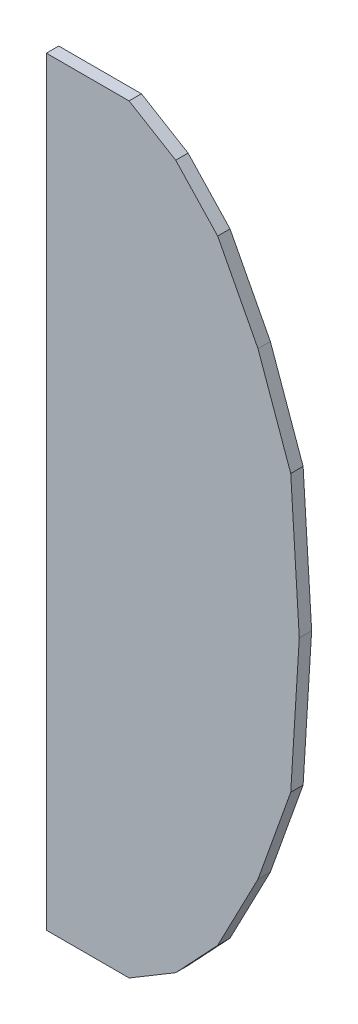
ISO-10303-21;
HEADER;
FILE_DESCRIPTION(('STEP AP214'),'2;1');
FILE_NAME('part.step','',(''),(''),'','','');
FILE_SCHEMA(('AUTOMOTIVE_DESIGN { 1 0 10303 214 1 1 1 1 }'));
ENDSEC;
DATA;
#1=APPLICATION_CONTEXT('core data for automotive mechanical design processes');
#2=APPLICATION_PROTOCOL_DEFINITION('international standard','automotive_design',2000,#1);
#3=PRODUCT_CONTEXT('',#1,'mechanical');
#4=PRODUCT('Part','Part','',(#3));
#5=PRODUCT_RELATED_PRODUCT_CATEGORY('part','',(#4));
#6=PRODUCT_DEFINITION_FORMATION('','',#4);
#7=PRODUCT_DEFINITION_CONTEXT('part definition',#1,'design');
#8=PRODUCT_DEFINITION('design','',#6,#7);
#9=PRODUCT_DEFINITION_SHAPE('','',#8);
#10=(LENGTH_UNIT() NAMED_UNIT(*) SI_UNIT(.MILLI.,.METRE.));
#11=(NAMED_UNIT(*) PLANE_ANGLE_UNIT() SI_UNIT($,.RADIAN.));
#12=(NAMED_UNIT(*) SI_UNIT($,.STERADIAN.) SOLID_ANGLE_UNIT());
#13=UNCERTAINTY_MEASURE_WITH_UNIT(LENGTH_MEASURE(1.E-05),#10,'distance_accuracy_value','');
#14=(GEOMETRIC_REPRESENTATION_CONTEXT(3) GLOBAL_UNCERTAINTY_ASSIGNED_CONTEXT((#13)) GLOBAL_UNIT_ASSIGNED_CONTEXT((#10,
#11,#12)) REPRESENTATION_CONTEXT('',''));
#15=CARTESIAN_POINT('',(0.,0.,0.));
#16=DIRECTION('',(0.,0.,1.));
#17=DIRECTION('',(1.,0.,0.));
#18=AXIS2_PLACEMENT_3D('',#15,#16,#17);
#19=CARTESIAN_POINT('',(31.874504293372,48.37997445989,1.1595000001));
#20=DIRECTION('',(0.,0.,1.));
#21=DIRECTION('',(1.,0.,0.));
#22=AXIS2_PLACEMENT_3D('',#19,#20,#21);
#23=PLANE('',#22);
#24=DIRECTION('',(-0.684511224486077,0.729002320677082,0.));
#25=VECTOR('',#24,1.);
#26=CARTESIAN_POINT('',(31.902834472656,48.741196289062,1.1595000001));
#27=LINE('',#26,#25);
#28=CARTESIAN_POINT('',(31.94591796875,48.6953125,1.1595000001));
#29=VERTEX_POINT('',#28);
#30=CARTESIAN_POINT('',(31.902834472656,48.741196289062,1.1595000001));
#31=VERTEX_POINT('',#30);
#32=EDGE_CURVE('E141',#29,#31,#27,.T.);
#33=ORIENTED_EDGE('',*,*,#32,.T.);
#34=DIRECTION('',(-0.857026283175948,0.515272694740969,0.));
#35=VECTOR('',#34,1.);
#36=CARTESIAN_POINT('',(31.854926757813,48.77,1.1595000001));
#37=LINE('',#36,#35);
#38=CARTESIAN_POINT('',(31.854926757813,48.77,1.1595000001));
#39=VERTEX_POINT('',#38);
#40=EDGE_CURVE('E210',#31,#39,#37,.T.);
#41=ORIENTED_EDGE('',*,*,#40,.T.);
#42=DIRECTION('',(-1.,0.,0.));
#43=VECTOR('',#42,1.);
#44=CARTESIAN_POINT('',(31.77,48.77,1.1595000001));
#45=LINE('',#44,#43);
#46=CARTESIAN_POINT('',(31.77,48.77,1.1595000001));
#47=VERTEX_POINT('',#46);
#48=EDGE_CURVE('E147',#39,#47,#45,.T.);
#49=ORIENTED_EDGE('',*,*,#48,.T.);
#50=DIRECTION('',(0.,-1.,0.));
#51=VECTOR('',#50,1.);
#52=CARTESIAN_POINT('',(31.77,47.99,1.1595000001));
#53=LINE('',#52,#51);
#54=CARTESIAN_POINT('',(31.77,47.99,1.1595000001));
#55=VERTEX_POINT('',#54);
#56=EDGE_CURVE('E11',#47,#55,#53,.T.);
#57=ORIENTED_EDGE('',*,*,#56,.T.);
#58=DIRECTION('',(1.,0.,0.));
#59=VECTOR('',#58,1.);
#60=CARTESIAN_POINT('',(31.855014648438,47.99,1.1595000001));
#61=LINE('',#60,#59);
#62=CARTESIAN_POINT('',(31.855014648438,47.99,1.1595000001));
#63=VERTEX_POINT('',#62);
#64=EDGE_CURVE('E28',#55,#63,#61,.T.);
#65=ORIENTED_EDGE('',*,*,#64,.T.);
#66=DIRECTION('',(0.857955823316851,0.513723471564911,0.));
#67=VECTOR('',#66,1.);
#68=CARTESIAN_POINT('',(31.902890625,48.018666992187,1.1595000001));
#69=LINE('',#68,#67);
#70=CARTESIAN_POINT('',(31.902890625,48.018666992187,1.1595000001));
#71=VERTEX_POINT('',#70);
#72=EDGE_CURVE('E93',#63,#71,#69,.T.);
#73=ORIENTED_EDGE('',*,*,#72,.T.);
#74=DIRECTION('',(0.684553491121047,0.72896263127405,0.));
#75=VECTOR('',#74,1.);
#76=CARTESIAN_POINT('',(31.945905761719,48.06447265625,1.1595000001));
#77=LINE('',#76,#75);
#78=CARTESIAN_POINT('',(31.945905761719,48.06447265625,1.1595000001));
#79=VERTEX_POINT('',#78);
#80=EDGE_CURVE('E88',#71,#79,#77,.T.);
#81=ORIENTED_EDGE('',*,*,#80,.T.);
#82=DIRECTION('',(0.461944236420167,0.88690897077332,0.));
#83=VECTOR('',#82,1.);
#84=CARTESIAN_POINT('',(31.987321777344,48.143989257813,1.1595000001));
#85=LINE('',#84,#83);
#86=CARTESIAN_POINT('',(31.987321777344,48.143989257813,1.1595000001));
#87=VERTEX_POINT('',#86);
#88=EDGE_CURVE('E118',#79,#87,#85,.T.);
#89=ORIENTED_EDGE('',*,*,#88,.T.);
#90=DIRECTION('',(0.336354954825115,0.941735283593322,0.));
#91=VECTOR('',#90,1.);
#92=CARTESIAN_POINT('',(32.020959472656,48.238168945312,1.1595000001));
#93=LINE('',#92,#91);
#94=CARTESIAN_POINT('',(32.020959472656,48.238168945312,1.1595000001));
#95=VERTEX_POINT('',#94);
#96=EDGE_CURVE('E158',#87,#95,#93,.T.);
#97=ORIENTED_EDGE('',*,*,#96,.T.);
#98=DIRECTION('',(0.0617403234525635,0.998092246468217,0.));
#99=VECTOR('',#98,1.);
#100=CARTESIAN_POINT('',(32.0297265625,48.379897460937,1.1595000001));
#101=LINE('',#100,#99);
#102=CARTESIAN_POINT('',(32.0297265625,48.379897460937,1.1595000001));
#103=VERTEX_POINT('',#102);
#104=EDGE_CURVE('E153',#95,#103,#101,.T.);
#105=ORIENTED_EDGE('',*,*,#104,.T.);
#106=DIRECTION('',(-0.0617682186821101,0.998090520524486,0.));
#107=VECTOR('',#106,1.);
#108=CARTESIAN_POINT('',(32.020954589844,48.521640625,1.1595000001));
#109=LINE('',#108,#107);
#110=CARTESIAN_POINT('',(32.020954589844,48.521640625,1.1595000001));
#111=VERTEX_POINT('',#110);
#112=EDGE_CURVE('E200',#103,#111,#109,.T.);
#113=ORIENTED_EDGE('',*,*,#112,.T.);
#114=DIRECTION('',(-0.33606439618799,0.941839010454972,0.));
#115=VECTOR('',#114,1.);
#116=CARTESIAN_POINT('',(31.987321777344,48.6158984375,1.1595000001));
#117=LINE('',#116,#115);
#118=CARTESIAN_POINT('',(31.987321777344,48.6158984375,1.1595000001));
#119=VERTEX_POINT('',#118);
#120=EDGE_CURVE('E162',#111,#119,#117,.T.);
#121=ORIENTED_EDGE('',*,*,#120,.T.);
#122=DIRECTION('',(-0.46230606285075,0.88672042056752,0.));
#123=VECTOR('',#122,1.);
#124=CARTESIAN_POINT('',(31.94591796875,48.6953125,1.1595000001));
#125=LINE('',#124,#123);
#126=EDGE_CURVE('E132',#119,#29,#125,.T.);
#127=ORIENTED_EDGE('',*,*,#126,.T.);
#128=EDGE_LOOP('',(#33,#41,#49,#57,#65,#73,#81,#89,#97,#105,#113,#121,#127));
#129=FACE_BOUND('',#128,.T.);
#130=ADVANCED_FACE('F17',(#129),#23,.T.);
#131=CARTESIAN_POINT('',(31.77,47.99,1.1468000001));
#132=DIRECTION('',(1.,0.,0.));
#133=DIRECTION('',(0.,1.,0.));
#134=AXIS2_PLACEMENT_3D('',#131,#132,#133);
#135=PLANE('',#134);
#136=DIRECTION('',(0.,0.,-1.));
#137=VECTOR('',#136,1.);
#138=CARTESIAN_POINT('',(31.77,48.77,1.1468000001));
#139=LINE('',#138,#137);
#140=CARTESIAN_POINT('',(31.77,48.77,1.1468000001));
#141=VERTEX_POINT('',#140);
#142=EDGE_CURVE('E130',#47,#141,#139,.T.);
#143=ORIENTED_EDGE('',*,*,#142,.T.);
#144=DIRECTION('',(0.,-1.,0.));
#145=VECTOR('',#144,1.);
#146=CARTESIAN_POINT('',(31.77,48.37997445989,1.1468000001));
#147=LINE('',#146,#145);
#148=CARTESIAN_POINT('',(31.77,47.99,1.1468000001));
#149=VERTEX_POINT('',#148);
#150=EDGE_CURVE('E178',#141,#149,#147,.T.);
#151=ORIENTED_EDGE('',*,*,#150,.T.);
#152=DIRECTION('',(0.,0.,1.));
#153=VECTOR('',#152,1.);
#154=CARTESIAN_POINT('',(31.77,47.99,1.1468000001));
#155=LINE('',#154,#153);
#156=EDGE_CURVE('E100',#149,#55,#155,.T.);
#157=ORIENTED_EDGE('',*,*,#156,.T.);
#158=ORIENTED_EDGE('',*,*,#56,.F.);
#159=EDGE_LOOP('',(#143,#151,#157,#158));
#160=FACE_BOUND('',#159,.T.);
#161=ADVANCED_FACE('F294',(#160),#135,.F.);
#162=CARTESIAN_POINT('',(31.855014648438,47.99,1.1468000001));
#163=DIRECTION('',(0.,1.,0.));
#164=DIRECTION('',(1.,0.,0.));
#165=AXIS2_PLACEMENT_3D('',#162,#163,#164);
#166=PLANE('',#165);
#167=ORIENTED_EDGE('',*,*,#156,.F.);
#168=DIRECTION('',(1.,0.,0.));
#169=VECTOR('',#168,1.);
#170=CARTESIAN_POINT('',(31.874504293372,47.99,1.1468000001));
#171=LINE('',#170,#169);
#172=CARTESIAN_POINT('',(31.855014648438,47.99,1.1468000001));
#173=VERTEX_POINT('',#172);
#174=EDGE_CURVE('E187',#149,#173,#171,.T.);
#175=ORIENTED_EDGE('',*,*,#174,.T.);
#176=DIRECTION('',(0.,0.,1.));
#177=VECTOR('',#176,1.);
#178=CARTESIAN_POINT('',(31.855014648438,47.99,1.1468000001));
#179=LINE('',#178,#177);
#180=EDGE_CURVE('E101',#173,#63,#179,.T.);
#181=ORIENTED_EDGE('',*,*,#180,.T.);
#182=ORIENTED_EDGE('',*,*,#64,.F.);
#183=EDGE_LOOP('',(#167,#175,#181,#182));
#184=FACE_BOUND('',#183,.T.);
#185=ADVANCED_FACE('F308',(#184),#166,.F.);
#186=CARTESIAN_POINT('',(31.902890625,48.018666992187,1.1468000001));
#187=DIRECTION('',(-0.513723471564911,0.857955823316851,0.));
#188=DIRECTION('',(0.,0.,1.));
#189=AXIS2_PLACEMENT_3D('',#186,#187,#188);
#190=PLANE('',#189);
#191=ORIENTED_EDGE('',*,*,#180,.F.);
#192=DIRECTION('',(0.857955823316851,0.513723471564911,0.));
#193=VECTOR('',#192,1.);
#194=CARTESIAN_POINT('',(31.855014648438,47.99,1.1468000001));
#195=LINE('',#194,#193);
#196=CARTESIAN_POINT('',(31.902890625,48.018666992187,1.1468000001));
#197=VERTEX_POINT('',#196);
#198=EDGE_CURVE('E115',#173,#197,#195,.T.);
#199=ORIENTED_EDGE('',*,*,#198,.T.);
#200=DIRECTION('',(0.,0.,1.));
#201=VECTOR('',#200,1.);
#202=CARTESIAN_POINT('',(31.902890625,48.018666992187,1.1468000001));
#203=LINE('',#202,#201);
#204=EDGE_CURVE('E107',#197,#71,#203,.T.);
#205=ORIENTED_EDGE('',*,*,#204,.T.);
#206=ORIENTED_EDGE('',*,*,#72,.F.);
#207=EDGE_LOOP('',(#191,#199,#205,#206));
#208=FACE_BOUND('',#207,.T.);
#209=ADVANCED_FACE('F113',(#208),#190,.F.);
#210=CARTESIAN_POINT('',(31.945905761719,48.06447265625,1.1468000001));
#211=DIRECTION('',(-0.72896263127405,0.684553491121047,0.));
#212=DIRECTION('',(0.,0.,1.));
#213=AXIS2_PLACEMENT_3D('',#210,#211,#212);
#214=PLANE('',#213);
#215=ORIENTED_EDGE('',*,*,#204,.F.);
#216=DIRECTION('',(0.684553491121578,0.728962631273551,0.));
#217=VECTOR('',#216,1.);
#218=CARTESIAN_POINT('',(31.902890625,48.018666992187,1.1468000001));
#219=LINE('',#218,#217);
#220=CARTESIAN_POINT('',(31.945905761719,48.06447265625,1.1468000001));
#221=VERTEX_POINT('',#220);
#222=EDGE_CURVE('E207',#197,#221,#219,.T.);
#223=ORIENTED_EDGE('',*,*,#222,.T.);
#224=DIRECTION('',(0.,0.,1.));
#225=VECTOR('',#224,1.);
#226=CARTESIAN_POINT('',(31.945905761719,48.06447265625,1.1468000001));
#227=LINE('',#226,#225);
#228=EDGE_CURVE('E110',#221,#79,#227,.T.);
#229=ORIENTED_EDGE('',*,*,#228,.T.);
#230=ORIENTED_EDGE('',*,*,#80,.F.);
#231=EDGE_LOOP('',(#215,#223,#229,#230));
#232=FACE_BOUND('',#231,.T.);
#233=ADVANCED_FACE('F105',(#232),#214,.F.);
#234=CARTESIAN_POINT('',(31.987321777344,48.143989257813,1.1468000001));
#235=DIRECTION('',(-0.88690897077332,0.461944236420167,0.));
#236=DIRECTION('',(0.,0.,1.));
#237=AXIS2_PLACEMENT_3D('',#234,#235,#236);
#238=PLANE('',#237);
#239=ORIENTED_EDGE('',*,*,#228,.F.);
#240=DIRECTION('',(0.461944236420167,0.88690897077332,0.));
#241=VECTOR('',#240,1.);
#242=CARTESIAN_POINT('',(31.945905761719,48.06447265625,1.1468000001));
#243=LINE('',#242,#241);
#244=CARTESIAN_POINT('',(31.987321777344,48.143989257813,1.1468000001));
#245=VERTEX_POINT('',#244);
#246=EDGE_CURVE('E171',#221,#245,#243,.T.);
#247=ORIENTED_EDGE('',*,*,#246,.T.);
#248=DIRECTION('',(0.,0.,1.));
#249=VECTOR('',#248,1.);
#250=CARTESIAN_POINT('',(31.987321777344,48.143989257813,1.1468000001));
#251=LINE('',#250,#249);
#252=EDGE_CURVE('E156',#245,#87,#251,.T.);
#253=ORIENTED_EDGE('',*,*,#252,.T.);
#254=ORIENTED_EDGE('',*,*,#88,.F.);
#255=EDGE_LOOP('',(#239,#247,#253,#254));
#256=FACE_BOUND('',#255,.T.);
#257=ADVANCED_FACE('F273',(#256),#238,.F.);
#258=CARTESIAN_POINT('',(32.020959472656,48.238168945312,1.1468000001));
#259=DIRECTION('',(-0.941735283593322,0.336354954825115,0.));
#260=DIRECTION('',(0.,0.,1.));
#261=AXIS2_PLACEMENT_3D('',#258,#259,#260);
#262=PLANE('',#261);
#263=ORIENTED_EDGE('',*,*,#252,.F.);
#264=DIRECTION('',(0.336354954825115,0.941735283593322,0.));
#265=VECTOR('',#264,1.);
#266=CARTESIAN_POINT('',(31.987321777344,48.143989257813,1.1468000001));
#267=LINE('',#266,#265);
#268=CARTESIAN_POINT('',(32.020959472656,48.238168945312,1.1468000001));
#269=VERTEX_POINT('',#268);
#270=EDGE_CURVE('E167',#245,#269,#267,.T.);
#271=ORIENTED_EDGE('',*,*,#270,.T.);
#272=DIRECTION('',(0.,0.,1.));
#273=VECTOR('',#272,1.);
#274=CARTESIAN_POINT('',(32.020959472656,48.238168945312,1.1468000001));
#275=LINE('',#274,#273);
#276=EDGE_CURVE('E157',#269,#95,#275,.T.);
#277=ORIENTED_EDGE('',*,*,#276,.T.);
#278=ORIENTED_EDGE('',*,*,#96,.F.);
#279=EDGE_LOOP('',(#263,#271,#277,#278));
#280=FACE_BOUND('',#279,.T.);
#281=ADVANCED_FACE('F271',(#280),#262,.F.);
#282=CARTESIAN_POINT('',(32.0297265625,48.379897460937,1.1468000001));
#283=DIRECTION('',(-0.998092246468217,0.0617403234525635,0.));
#284=DIRECTION('',(0.,0.,1.));
#285=AXIS2_PLACEMENT_3D('',#282,#283,#284);
#286=PLANE('',#285);
#287=ORIENTED_EDGE('',*,*,#276,.F.);
#288=DIRECTION('',(0.0617403234522248,0.998092246468238,0.));
#289=VECTOR('',#288,1.);
#290=CARTESIAN_POINT('',(32.020959472656,48.238168945312,1.1468000001));
#291=LINE('',#290,#289);
#292=CARTESIAN_POINT('',(32.0297265625,48.379897460937,1.1468000001));
#293=VERTEX_POINT('',#292);
#294=EDGE_CURVE('E172',#269,#293,#291,.T.);
#295=ORIENTED_EDGE('',*,*,#294,.T.);
#296=DIRECTION('',(0.,0.,1.));
#297=VECTOR('',#296,1.);
#298=CARTESIAN_POINT('',(32.0297265625,48.379897460937,1.1468000001));
#299=LINE('',#298,#297);
#300=EDGE_CURVE('E166',#293,#103,#299,.T.);
#301=ORIENTED_EDGE('',*,*,#300,.T.);
#302=ORIENTED_EDGE('',*,*,#104,.F.);
#303=EDGE_LOOP('',(#287,#295,#301,#302));
#304=FACE_BOUND('',#303,.T.);
#305=ADVANCED_FACE('F229',(#304),#286,.F.);
#306=CARTESIAN_POINT('',(32.020954589844,48.521640625,1.1468000001));
#307=DIRECTION('',(-0.998090520524486,-0.0617682186821101,0.));
#308=DIRECTION('',(-0.0617682186821101,0.998090520524486,0.));
#309=AXIS2_PLACEMENT_3D('',#306,#307,#308);
#310=PLANE('',#309);
#311=ORIENTED_EDGE('',*,*,#300,.F.);
#312=DIRECTION('',(-0.0617682186816798,0.998090520524512,0.));
#313=VECTOR('',#312,1.);
#314=CARTESIAN_POINT('',(32.0297265625,48.379897460937,1.1468000001));
#315=LINE('',#314,#313);
#316=CARTESIAN_POINT('',(32.020954589844,48.521640625,1.1468000001));
#317=VERTEX_POINT('',#316);
#318=EDGE_CURVE('E21',#293,#317,#315,.T.);
#319=ORIENTED_EDGE('',*,*,#318,.T.);
#320=DIRECTION('',(0.,0.,1.));
#321=VECTOR('',#320,1.);
#322=CARTESIAN_POINT('',(32.020954589844,48.521640625,1.1468000001));
#323=LINE('',#322,#321);
#324=EDGE_CURVE('E136',#317,#111,#323,.T.);
#325=ORIENTED_EDGE('',*,*,#324,.T.);
#326=ORIENTED_EDGE('',*,*,#112,.F.);
#327=EDGE_LOOP('',(#311,#319,#325,#326));
#328=FACE_BOUND('',#327,.T.);
#329=ADVANCED_FACE('F236',(#328),#310,.F.);
#330=CARTESIAN_POINT('',(31.987321777344,48.6158984375,1.1468000001));
#331=DIRECTION('',(-0.941839010454972,-0.33606439618799,0.));
#332=DIRECTION('',(-0.33606439618799,0.941839010454972,0.));
#333=AXIS2_PLACEMENT_3D('',#330,#331,#332);
#334=PLANE('',#333);
#335=ORIENTED_EDGE('',*,*,#324,.F.);
#336=DIRECTION('',(-0.33606439618799,0.941839010454972,0.));
#337=VECTOR('',#336,1.);
#338=CARTESIAN_POINT('',(32.020954589844,48.521640625,1.1468000001));
#339=LINE('',#338,#337);
#340=CARTESIAN_POINT('',(31.987321777344,48.6158984375,1.1468000001));
#341=VERTEX_POINT('',#340);
#342=EDGE_CURVE('E179',#317,#341,#339,.T.);
#343=ORIENTED_EDGE('',*,*,#342,.T.);
#344=DIRECTION('',(0.,0.,1.));
#345=VECTOR('',#344,1.);
#346=CARTESIAN_POINT('',(31.987321777344,48.6158984375,1.1468000001));
#347=LINE('',#346,#345);
#348=EDGE_CURVE('E137',#341,#119,#347,.T.);
#349=ORIENTED_EDGE('',*,*,#348,.T.);
#350=ORIENTED_EDGE('',*,*,#120,.F.);
#351=EDGE_LOOP('',(#335,#343,#349,#350));
#352=FACE_BOUND('',#351,.T.);
#353=ADVANCED_FACE('F384',(#352),#334,.F.);
#354=CARTESIAN_POINT('',(31.94591796875,48.6953125,1.1468000001));
#355=DIRECTION('',(-0.88672042056752,-0.46230606285075,0.));
#356=DIRECTION('',(-0.46230606285075,0.88672042056752,0.));
#357=AXIS2_PLACEMENT_3D('',#354,#355,#356);
#358=PLANE('',#357);
#359=ORIENTED_EDGE('',*,*,#348,.F.);
#360=DIRECTION('',(-0.46230606285116,0.886720420567306,0.));
#361=VECTOR('',#360,1.);
#362=CARTESIAN_POINT('',(31.987321777344,48.6158984375,1.1468000001));
#363=LINE('',#362,#361);
#364=CARTESIAN_POINT('',(31.94591796875,48.6953125,1.1468000001));
#365=VERTEX_POINT('',#364);
#366=EDGE_CURVE('E183',#341,#365,#363,.T.);
#367=ORIENTED_EDGE('',*,*,#366,.T.);
#368=DIRECTION('',(0.,0.,1.));
#369=VECTOR('',#368,1.);
#370=CARTESIAN_POINT('',(31.94591796875,48.6953125,1.1468000001));
#371=LINE('',#370,#369);
#372=EDGE_CURVE('E196',#365,#29,#371,.T.);
#373=ORIENTED_EDGE('',*,*,#372,.T.);
#374=ORIENTED_EDGE('',*,*,#126,.F.);
#375=EDGE_LOOP('',(#359,#367,#373,#374));
#376=FACE_BOUND('',#375,.T.);
#377=ADVANCED_FACE('F329',(#376),#358,.F.);
#378=CARTESIAN_POINT('',(31.902834472656,48.741196289062,1.1468000001));
#379=DIRECTION('',(-0.729002320677082,-0.684511224486077,0.));
#380=DIRECTION('',(-0.684511224486077,0.729002320677082,0.));
#381=AXIS2_PLACEMENT_3D('',#378,#379,#380);
#382=PLANE('',#381);
#383=ORIENTED_EDGE('',*,*,#372,.F.);
#384=DIRECTION('',(-0.684511224485578,0.729002320677551,0.));
#385=VECTOR('',#384,1.);
#386=CARTESIAN_POINT('',(31.94591796875,48.6953125,1.1468000001));
#387=LINE('',#386,#385);
#388=CARTESIAN_POINT('',(31.902834472656,48.741196289062,1.1468000001));
#389=VERTEX_POINT('',#388);
#390=EDGE_CURVE('E146',#365,#389,#387,.T.);
#391=ORIENTED_EDGE('',*,*,#390,.T.);
#392=DIRECTION('',(0.,0.,1.));
#393=VECTOR('',#392,1.);
#394=CARTESIAN_POINT('',(31.902834472656,48.741196289062,1.1468000001));
#395=LINE('',#394,#393);
#396=EDGE_CURVE('E150',#389,#31,#395,.T.);
#397=ORIENTED_EDGE('',*,*,#396,.T.);
#398=ORIENTED_EDGE('',*,*,#32,.F.);
#399=EDGE_LOOP('',(#383,#391,#397,#398));
#400=FACE_BOUND('',#399,.T.);
#401=ADVANCED_FACE('F19',(#400),#382,.F.);
#402=CARTESIAN_POINT('',(31.854926757813,48.77,1.1468000001));
#403=DIRECTION('',(-0.515272694740969,-0.857026283175948,0.));
#404=DIRECTION('',(-0.857026283175948,0.515272694740969,0.));
#405=AXIS2_PLACEMENT_3D('',#402,#403,#404);
#406=PLANE('',#405);
#407=ORIENTED_EDGE('',*,*,#396,.F.);
#408=DIRECTION('',(-0.857026283175948,0.515272694740969,0.));
#409=VECTOR('',#408,1.);
#410=CARTESIAN_POINT('',(31.902834472656,48.741196289062,1.1468000001));
#411=LINE('',#410,#409);
#412=CARTESIAN_POINT('',(31.854926757813,48.77,1.1468000001));
#413=VERTEX_POINT('',#412);
#414=EDGE_CURVE('E142',#389,#413,#411,.T.);
#415=ORIENTED_EDGE('',*,*,#414,.T.);
#416=DIRECTION('',(0.,0.,1.));
#417=VECTOR('',#416,1.);
#418=CARTESIAN_POINT('',(31.854926757813,48.77,1.1468000001));
#419=LINE('',#418,#417);
#420=EDGE_CURVE('E126',#413,#39,#419,.T.);
#421=ORIENTED_EDGE('',*,*,#420,.T.);
#422=ORIENTED_EDGE('',*,*,#40,.F.);
#423=EDGE_LOOP('',(#407,#415,#421,#422));
#424=FACE_BOUND('',#423,.T.);
#425=ADVANCED_FACE('F328',(#424),#406,.F.);
#426=CARTESIAN_POINT('',(31.77,48.77,1.1468000001));
#427=DIRECTION('',(0.,-1.,0.));
#428=DIRECTION('',(0.,0.,-1.));
#429=AXIS2_PLACEMENT_3D('',#426,#427,#428);
#430=PLANE('',#429);
#431=ORIENTED_EDGE('',*,*,#420,.F.);
#432=DIRECTION('',(-1.,0.,0.));
#433=VECTOR('',#432,1.);
#434=CARTESIAN_POINT('',(31.874504293372,48.77,1.1468000001));
#435=LINE('',#434,#433);
#436=EDGE_CURVE('E131',#413,#141,#435,.T.);
#437=ORIENTED_EDGE('',*,*,#436,.T.);
#438=ORIENTED_EDGE('',*,*,#142,.F.);
#439=ORIENTED_EDGE('',*,*,#48,.F.);
#440=EDGE_LOOP('',(#431,#437,#438,#439));
#441=FACE_BOUND('',#440,.T.);
#442=ADVANCED_FACE('F300',(#441),#430,.F.);
#443=CARTESIAN_POINT('',(31.874504293372,48.37997445989,1.1468000001));
#444=DIRECTION('',(0.,0.,1.));
#445=DIRECTION('',(1.,0.,0.));
#446=AXIS2_PLACEMENT_3D('',#443,#444,#445);
#447=PLANE('',#446);
#448=ORIENTED_EDGE('',*,*,#414,.F.);
#449=ORIENTED_EDGE('',*,*,#390,.F.);
#450=ORIENTED_EDGE('',*,*,#366,.F.);
#451=ORIENTED_EDGE('',*,*,#342,.F.);
#452=ORIENTED_EDGE('',*,*,#318,.F.);
#453=ORIENTED_EDGE('',*,*,#294,.F.);
#454=ORIENTED_EDGE('',*,*,#270,.F.);
#455=ORIENTED_EDGE('',*,*,#246,.F.);
#456=ORIENTED_EDGE('',*,*,#222,.F.);
#457=ORIENTED_EDGE('',*,*,#198,.F.);
#458=ORIENTED_EDGE('',*,*,#174,.F.);
#459=ORIENTED_EDGE('',*,*,#150,.F.);
#460=ORIENTED_EDGE('',*,*,#436,.F.);
#461=EDGE_LOOP('',(#448,#449,#450,#451,#452,#453,#454,#455,#456,#457,#458,#459,#460));
#462=FACE_BOUND('',#461,.T.);
#463=ADVANCED_FACE('F303',(#462),#447,.F.);
#464=CLOSED_SHELL('',(#130,#161,#185,#209,#233,#257,#281,#305,#329,#353,#377,#401,#425,#442,#463));
#465=MANIFOLD_SOLID_BREP('B1',#464);
#466=ADVANCED_BREP_SHAPE_REPRESENTATION('',(#18,#465),#14);
#467=SHAPE_DEFINITION_REPRESENTATION(#9,#466);
ENDSEC;
END-ISO-10303-21;
